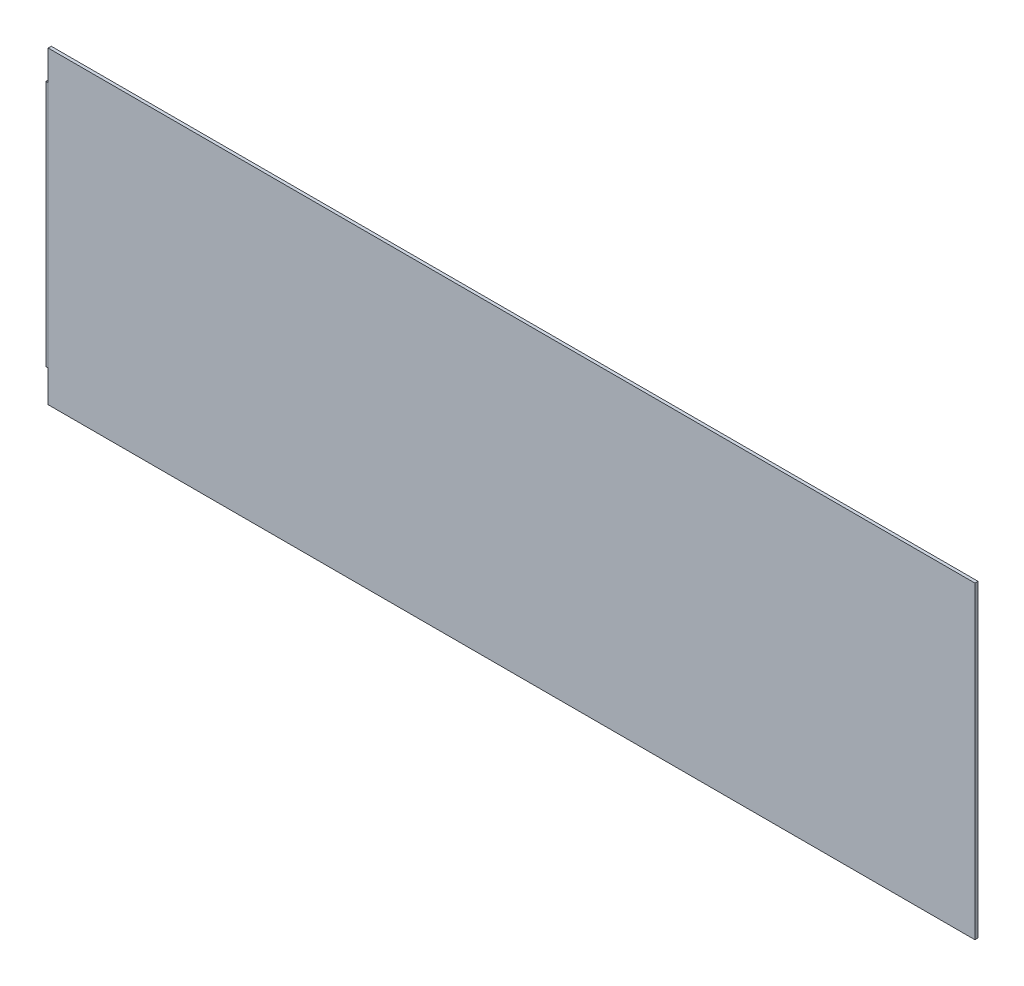
ISO-10303-21;
HEADER;
FILE_DESCRIPTION(('STEP AP214'),'2;1');
FILE_NAME('part.step','',(''),(''),'','','');
FILE_SCHEMA(('AUTOMOTIVE_DESIGN { 1 0 10303 214 1 1 1 1 }'));
ENDSEC;
DATA;
#1=APPLICATION_CONTEXT('core data for automotive mechanical design processes');
#2=APPLICATION_PROTOCOL_DEFINITION('international standard','automotive_design',2000,#1);
#3=PRODUCT_CONTEXT('',#1,'mechanical');
#4=PRODUCT('Part','Part','',(#3));
#5=PRODUCT_RELATED_PRODUCT_CATEGORY('part','',(#4));
#6=PRODUCT_DEFINITION_FORMATION('','',#4);
#7=PRODUCT_DEFINITION_CONTEXT('part definition',#1,'design');
#8=PRODUCT_DEFINITION('design','',#6,#7);
#9=PRODUCT_DEFINITION_SHAPE('','',#8);
#10=(LENGTH_UNIT() NAMED_UNIT(*) SI_UNIT(.MILLI.,.METRE.));
#11=(NAMED_UNIT(*) PLANE_ANGLE_UNIT() SI_UNIT($,.RADIAN.));
#12=(NAMED_UNIT(*) SI_UNIT($,.STERADIAN.) SOLID_ANGLE_UNIT());
#13=UNCERTAINTY_MEASURE_WITH_UNIT(LENGTH_MEASURE(1.E-05),#10,'distance_accuracy_value','');
#14=(GEOMETRIC_REPRESENTATION_CONTEXT(3) GLOBAL_UNCERTAINTY_ASSIGNED_CONTEXT((#13)) GLOBAL_UNIT_ASSIGNED_CONTEXT((#10,
#11,#12)) REPRESENTATION_CONTEXT('',''));
#15=CARTESIAN_POINT('',(0.,0.,0.));
#16=DIRECTION('',(0.,0.,1.));
#17=DIRECTION('',(1.,0.,0.));
#18=AXIS2_PLACEMENT_3D('',#15,#16,#17);
#19=CARTESIAN_POINT('',(-750.,-250.,5.));
#20=DIRECTION('',(1.,0.,0.));
#21=DIRECTION('',(0.,0.,-1.));
#22=AXIS2_PLACEMENT_3D('',#19,#20,#21);
#23=PLANE('',#22);
#24=DIRECTION('',(0.,-1.,0.));
#25=VECTOR('',#24,1.);
#26=CARTESIAN_POINT('',(-750.,-250.,0.));
#27=LINE('',#26,#25);
#28=CARTESIAN_POINT('',(-750.,250.,0.));
#29=VERTEX_POINT('',#28);
#30=CARTESIAN_POINT('',(-750.,-250.,0.));
#31=VERTEX_POINT('',#30);
#32=EDGE_CURVE('E146',#29,#31,#27,.T.);
#33=ORIENTED_EDGE('',*,*,#32,.T.);
#34=DIRECTION('',(0.,0.,-1.));
#35=VECTOR('',#34,1.);
#36=CARTESIAN_POINT('',(-750.,-250.,5.));
#37=LINE('',#36,#35);
#38=CARTESIAN_POINT('',(-750.,-250.,5.));
#39=VERTEX_POINT('',#38);
#40=EDGE_CURVE('E151',#39,#31,#37,.T.);
#41=ORIENTED_EDGE('',*,*,#40,.F.);
#42=DIRECTION('',(0.,-1.,0.));
#43=VECTOR('',#42,1.);
#44=CARTESIAN_POINT('',(-750.,-250.,5.));
#45=LINE('',#44,#43);
#46=CARTESIAN_POINT('',(-750.,250.,5.));
#47=VERTEX_POINT('',#46);
#48=EDGE_CURVE('E140',#47,#39,#45,.T.);
#49=ORIENTED_EDGE('',*,*,#48,.F.);
#50=DIRECTION('',(0.,0.,-1.));
#51=VECTOR('',#50,1.);
#52=CARTESIAN_POINT('',(-750.,250.,5.));
#53=LINE('',#52,#51);
#54=EDGE_CURVE('E48',#47,#29,#53,.T.);
#55=ORIENTED_EDGE('',*,*,#54,.T.);
#56=EDGE_LOOP('',(#33,#41,#49,#55));
#57=FACE_BOUND('',#56,.T.);
#58=DIRECTION('',(0.,1.,0.));
#59=VECTOR('',#58,1.);
#60=CARTESIAN_POINT('',(-750.,200.,3.50000000000001));
#61=LINE('',#60,#59);
#62=CARTESIAN_POINT('',(-750.,-200.,3.50000000000006));
#63=VERTEX_POINT('',#62);
#64=CARTESIAN_POINT('',(-750.,200.,3.50000000000001));
#65=VERTEX_POINT('',#64);
#66=EDGE_CURVE('E55',#63,#65,#61,.T.);
#67=ORIENTED_EDGE('',*,*,#66,.F.);
#68=DIRECTION('',(0.,0.,1.));
#69=VECTOR('',#68,1.);
#70=CARTESIAN_POINT('',(-750.,-200.,1.50000000000006));
#71=LINE('',#70,#69);
#72=CARTESIAN_POINT('',(-750.,-200.,1.50000000000006));
#73=VERTEX_POINT('',#72);
#74=EDGE_CURVE('E59',#73,#63,#71,.T.);
#75=ORIENTED_EDGE('',*,*,#74,.F.);
#76=DIRECTION('',(0.,-1.,0.));
#77=VECTOR('',#76,1.);
#78=CARTESIAN_POINT('',(-750.,200.,1.50000000000001));
#79=LINE('',#78,#77);
#80=CARTESIAN_POINT('',(-750.,200.,1.50000000000001));
#81=VERTEX_POINT('',#80);
#82=EDGE_CURVE('E308',#81,#73,#79,.T.);
#83=ORIENTED_EDGE('',*,*,#82,.F.);
#84=DIRECTION('',(0.,0.,-1.));
#85=VECTOR('',#84,1.);
#86=CARTESIAN_POINT('',(-750.,200.,1.50000000000001));
#87=LINE('',#86,#85);
#88=EDGE_CURVE('E314',#65,#81,#87,.T.);
#89=ORIENTED_EDGE('',*,*,#88,.F.);
#90=EDGE_LOOP('',(#67,#75,#83,#89));
#91=FACE_BOUND('',#90,.T.);
#92=ADVANCED_FACE('F40',(#57,#91),#23,.F.);
#93=CARTESIAN_POINT('',(750.,-250.,5.));
#94=DIRECTION('',(-1.,0.,0.));
#95=DIRECTION('',(0.,0.,1.));
#96=AXIS2_PLACEMENT_3D('',#93,#94,#95);
#97=PLANE('',#96);
#98=DIRECTION('',(0.,1.,0.));
#99=VECTOR('',#98,1.);
#100=CARTESIAN_POINT('',(750.,-250.,0.));
#101=LINE('',#100,#99);
#102=CARTESIAN_POINT('',(750.,-250.,0.));
#103=VERTEX_POINT('',#102);
#104=CARTESIAN_POINT('',(750.,250.,0.));
#105=VERTEX_POINT('',#104);
#106=EDGE_CURVE('E125',#103,#105,#101,.T.);
#107=ORIENTED_EDGE('',*,*,#106,.T.);
#108=DIRECTION('',(0.,0.,-1.));
#109=VECTOR('',#108,1.);
#110=CARTESIAN_POINT('',(750.,250.,5.));
#111=LINE('',#110,#109);
#112=CARTESIAN_POINT('',(750.,250.,5.));
#113=VERTEX_POINT('',#112);
#114=EDGE_CURVE('E11',#113,#105,#111,.T.);
#115=ORIENTED_EDGE('',*,*,#114,.F.);
#116=DIRECTION('',(0.,1.,0.));
#117=VECTOR('',#116,1.);
#118=CARTESIAN_POINT('',(750.,-250.,5.));
#119=LINE('',#118,#117);
#120=CARTESIAN_POINT('',(750.,-250.,5.));
#121=VERTEX_POINT('',#120);
#122=EDGE_CURVE('E134',#121,#113,#119,.T.);
#123=ORIENTED_EDGE('',*,*,#122,.F.);
#124=DIRECTION('',(0.,0.,-1.));
#125=VECTOR('',#124,1.);
#126=CARTESIAN_POINT('',(750.,-250.,5.));
#127=LINE('',#126,#125);
#128=EDGE_CURVE('E143',#121,#103,#127,.T.);
#129=ORIENTED_EDGE('',*,*,#128,.T.);
#130=EDGE_LOOP('',(#107,#115,#123,#129));
#131=FACE_BOUND('',#130,.T.);
#132=ADVANCED_FACE('F42',(#131),#97,.F.);
#133=CARTESIAN_POINT('',(-750.,250.,5.));
#134=DIRECTION('',(0.,-1.,0.));
#135=DIRECTION('',(0.,0.,-1.));
#136=AXIS2_PLACEMENT_3D('',#133,#134,#135);
#137=PLANE('',#136);
#138=DIRECTION('',(-1.,0.,0.));
#139=VECTOR('',#138,1.);
#140=CARTESIAN_POINT('',(-750.,250.,0.));
#141=LINE('',#140,#139);
#142=EDGE_CURVE('E128',#105,#29,#141,.T.);
#143=ORIENTED_EDGE('',*,*,#142,.T.);
#144=ORIENTED_EDGE('',*,*,#54,.F.);
#145=DIRECTION('',(-1.,0.,0.));
#146=VECTOR('',#145,1.);
#147=CARTESIAN_POINT('',(-750.,250.,5.));
#148=LINE('',#147,#146);
#149=EDGE_CURVE('E137',#113,#47,#148,.T.);
#150=ORIENTED_EDGE('',*,*,#149,.F.);
#151=ORIENTED_EDGE('',*,*,#114,.T.);
#152=EDGE_LOOP('',(#143,#144,#150,#151));
#153=FACE_BOUND('',#152,.T.);
#154=ADVANCED_FACE('F173',(#153),#137,.F.);
#155=CARTESIAN_POINT('',(-750.,-250.,5.));
#156=DIRECTION('',(0.,1.,0.));
#157=DIRECTION('',(0.,0.,1.));
#158=AXIS2_PLACEMENT_3D('',#155,#156,#157);
#159=PLANE('',#158);
#160=DIRECTION('',(1.,0.,0.));
#161=VECTOR('',#160,1.);
#162=CARTESIAN_POINT('',(-750.,-250.,0.));
#163=LINE('',#162,#161);
#164=EDGE_CURVE('E138',#31,#103,#163,.T.);
#165=ORIENTED_EDGE('',*,*,#164,.T.);
#166=ORIENTED_EDGE('',*,*,#128,.F.);
#167=DIRECTION('',(1.,0.,0.));
#168=VECTOR('',#167,1.);
#169=CARTESIAN_POINT('',(-750.,-250.,5.));
#170=LINE('',#169,#168);
#171=EDGE_CURVE('E142',#39,#121,#170,.T.);
#172=ORIENTED_EDGE('',*,*,#171,.F.);
#173=ORIENTED_EDGE('',*,*,#40,.T.);
#174=EDGE_LOOP('',(#165,#166,#172,#173));
#175=FACE_BOUND('',#174,.T.);
#176=ADVANCED_FACE('F166',(#175),#159,.F.);
#177=CARTESIAN_POINT('',(0.,0.,5.));
#178=DIRECTION('',(0.,0.,-1.));
#179=DIRECTION('',(-1.,0.,0.));
#180=AXIS2_PLACEMENT_3D('',#177,#178,#179);
#181=PLANE('',#180);
#182=ORIENTED_EDGE('',*,*,#122,.T.);
#183=ORIENTED_EDGE('',*,*,#149,.T.);
#184=ORIENTED_EDGE('',*,*,#48,.T.);
#185=ORIENTED_EDGE('',*,*,#171,.T.);
#186=EDGE_LOOP('',(#182,#183,#184,#185));
#187=FACE_BOUND('',#186,.T.);
#188=ADVANCED_FACE('F172',(#187),#181,.F.);
#189=CARTESIAN_POINT('',(0.,0.,0.));
#190=DIRECTION('',(0.,0.,-1.));
#191=DIRECTION('',(-1.,0.,0.));
#192=AXIS2_PLACEMENT_3D('',#189,#190,#191);
#193=PLANE('',#192);
#194=ORIENTED_EDGE('',*,*,#106,.F.);
#195=ORIENTED_EDGE('',*,*,#164,.F.);
#196=ORIENTED_EDGE('',*,*,#32,.F.);
#197=ORIENTED_EDGE('',*,*,#142,.F.);
#198=EDGE_LOOP('',(#194,#195,#196,#197));
#199=FACE_BOUND('',#198,.T.);
#200=ADVANCED_FACE('F163',(#199),#193,.T.);
#201=CARTESIAN_POINT('',(-755.,200.,3.50000000000001));
#202=DIRECTION('',(0.,0.,-1.));
#203=DIRECTION('',(0.,1.,0.));
#204=AXIS2_PLACEMENT_3D('',#201,#202,#203);
#205=PLANE('',#204);
#206=ORIENTED_EDGE('',*,*,#66,.T.);
#207=DIRECTION('',(1.,0.,0.));
#208=VECTOR('',#207,1.);
#209=CARTESIAN_POINT('',(-755.,200.,3.50000000000001));
#210=LINE('',#209,#208);
#211=CARTESIAN_POINT('',(-755.,200.,3.50000000000001));
#212=VERTEX_POINT('',#211);
#213=EDGE_CURVE('E108',#212,#65,#210,.T.);
#214=ORIENTED_EDGE('',*,*,#213,.F.);
#215=DIRECTION('',(0.,1.,0.));
#216=VECTOR('',#215,1.);
#217=CARTESIAN_POINT('',(-755.,200.,3.50000000000001));
#218=LINE('',#217,#216);
#219=CARTESIAN_POINT('',(-755.,-200.,3.50000000000006));
#220=VERTEX_POINT('',#219);
#221=EDGE_CURVE('E114',#220,#212,#218,.T.);
#222=ORIENTED_EDGE('',*,*,#221,.F.);
#223=DIRECTION('',(1.,0.,0.));
#224=VECTOR('',#223,1.);
#225=CARTESIAN_POINT('',(-755.,-200.,3.50000000000006));
#226=LINE('',#225,#224);
#227=EDGE_CURVE('E306',#220,#63,#226,.T.);
#228=ORIENTED_EDGE('',*,*,#227,.T.);
#229=EDGE_LOOP('',(#206,#214,#222,#228));
#230=FACE_BOUND('',#229,.T.);
#231=ADVANCED_FACE('F124',(#230),#205,.F.);
#232=CARTESIAN_POINT('',(-755.,200.,1.50000000000001));
#233=DIRECTION('',(0.,-1.,0.));
#234=DIRECTION('',(0.,0.,-1.));
#235=AXIS2_PLACEMENT_3D('',#232,#233,#234);
#236=PLANE('',#235);
#237=ORIENTED_EDGE('',*,*,#88,.T.);
#238=DIRECTION('',(1.,0.,0.));
#239=VECTOR('',#238,1.);
#240=CARTESIAN_POINT('',(-755.,200.,1.50000000000001));
#241=LINE('',#240,#239);
#242=CARTESIAN_POINT('',(-755.,200.,1.50000000000001));
#243=VERTEX_POINT('',#242);
#244=EDGE_CURVE('E110',#243,#81,#241,.T.);
#245=ORIENTED_EDGE('',*,*,#244,.F.);
#246=DIRECTION('',(0.,0.,-1.));
#247=VECTOR('',#246,1.);
#248=CARTESIAN_POINT('',(-755.,200.,1.50000000000001));
#249=LINE('',#248,#247);
#250=EDGE_CURVE('E103',#212,#243,#249,.T.);
#251=ORIENTED_EDGE('',*,*,#250,.F.);
#252=ORIENTED_EDGE('',*,*,#213,.T.);
#253=EDGE_LOOP('',(#237,#245,#251,#252));
#254=FACE_BOUND('',#253,.T.);
#255=ADVANCED_FACE('F106',(#254),#236,.F.);
#256=CARTESIAN_POINT('',(-755.,200.,1.50000000000001));
#257=DIRECTION('',(0.,0.,1.));
#258=DIRECTION('',(0.,-1.,0.));
#259=AXIS2_PLACEMENT_3D('',#256,#257,#258);
#260=PLANE('',#259);
#261=ORIENTED_EDGE('',*,*,#82,.T.);
#262=DIRECTION('',(1.,0.,0.));
#263=VECTOR('',#262,1.);
#264=CARTESIAN_POINT('',(-755.,-200.,1.50000000000006));
#265=LINE('',#264,#263);
#266=CARTESIAN_POINT('',(-755.,-200.,1.50000000000006));
#267=VERTEX_POINT('',#266);
#268=EDGE_CURVE('E130',#267,#73,#265,.T.);
#269=ORIENTED_EDGE('',*,*,#268,.F.);
#270=DIRECTION('',(0.,-1.,0.));
#271=VECTOR('',#270,1.);
#272=CARTESIAN_POINT('',(-755.,200.,1.50000000000001));
#273=LINE('',#272,#271);
#274=EDGE_CURVE('E113',#243,#267,#273,.T.);
#275=ORIENTED_EDGE('',*,*,#274,.F.);
#276=ORIENTED_EDGE('',*,*,#244,.T.);
#277=EDGE_LOOP('',(#261,#269,#275,#276));
#278=FACE_BOUND('',#277,.T.);
#279=ADVANCED_FACE('F193',(#278),#260,.F.);
#280=CARTESIAN_POINT('',(-755.,-200.,1.50000000000006));
#281=DIRECTION('',(0.,1.,0.));
#282=DIRECTION('',(0.,0.,1.));
#283=AXIS2_PLACEMENT_3D('',#280,#281,#282);
#284=PLANE('',#283);
#285=ORIENTED_EDGE('',*,*,#74,.T.);
#286=ORIENTED_EDGE('',*,*,#227,.F.);
#287=DIRECTION('',(0.,0.,1.));
#288=VECTOR('',#287,1.);
#289=CARTESIAN_POINT('',(-755.,-200.,1.50000000000006));
#290=LINE('',#289,#288);
#291=EDGE_CURVE('E119',#267,#220,#290,.T.);
#292=ORIENTED_EDGE('',*,*,#291,.F.);
#293=ORIENTED_EDGE('',*,*,#268,.T.);
#294=EDGE_LOOP('',(#285,#286,#292,#293));
#295=FACE_BOUND('',#294,.T.);
#296=ADVANCED_FACE('F196',(#295),#284,.F.);
#297=CARTESIAN_POINT('',(-755.,0.,0.));
#298=DIRECTION('',(-1.,0.,0.));
#299=DIRECTION('',(0.,0.,1.));
#300=AXIS2_PLACEMENT_3D('',#297,#298,#299);
#301=PLANE('',#300);
#302=ORIENTED_EDGE('',*,*,#221,.T.);
#303=ORIENTED_EDGE('',*,*,#250,.T.);
#304=ORIENTED_EDGE('',*,*,#274,.T.);
#305=ORIENTED_EDGE('',*,*,#291,.T.);
#306=EDGE_LOOP('',(#302,#303,#304,#305));
#307=FACE_BOUND('',#306,.T.);
#308=ADVANCED_FACE('F117',(#307),#301,.T.);
#309=CLOSED_SHELL('',(#92,#132,#154,#176,#188,#200,#231,#255,#279,#296,#308));
#310=MANIFOLD_SOLID_BREP('B2',#309);
#311=ADVANCED_BREP_SHAPE_REPRESENTATION('',(#18,#310),#14);
#312=SHAPE_DEFINITION_REPRESENTATION(#9,#311);
ENDSEC;
END-ISO-10303-21;
